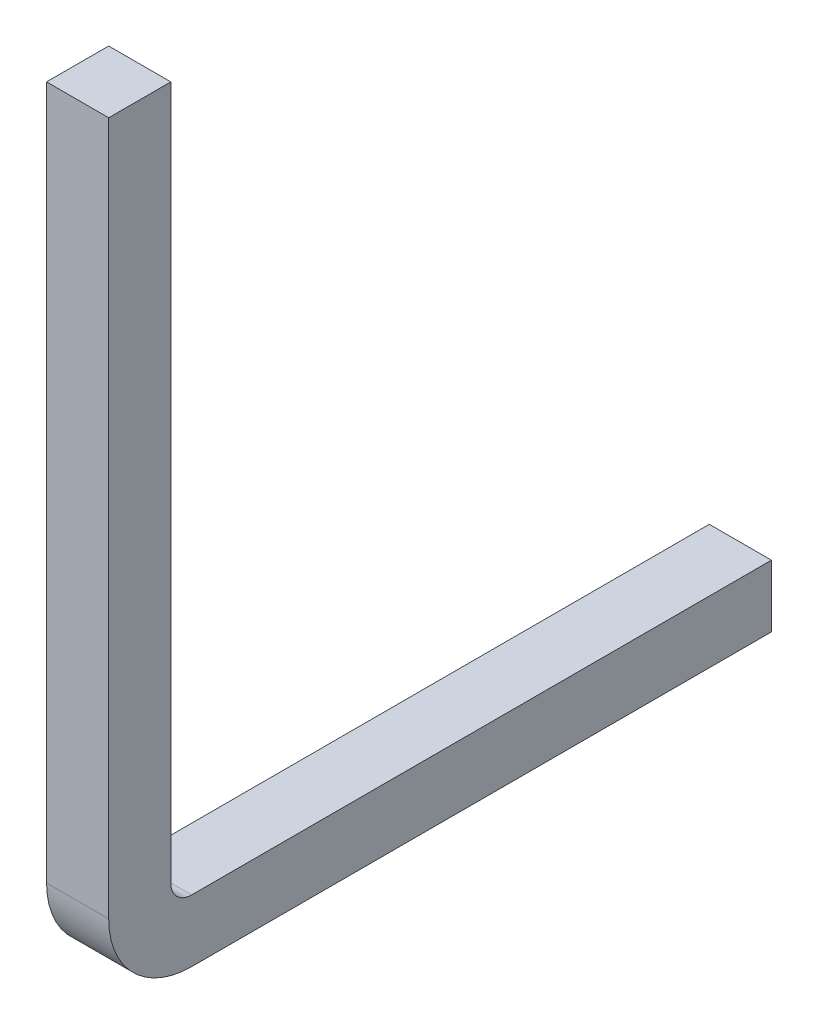
ISO-10303-21;
HEADER;
FILE_DESCRIPTION(('STEP AP214'),'2;1');
FILE_NAME('part.step','',(''),(''),'','','');
FILE_SCHEMA(('AUTOMOTIVE_DESIGN { 1 0 10303 214 1 1 1 1 }'));
ENDSEC;
DATA;
#1=APPLICATION_CONTEXT('core data for automotive mechanical design processes');
#2=APPLICATION_PROTOCOL_DEFINITION('international standard','automotive_design',2000,#1);
#3=PRODUCT_CONTEXT('',#1,'mechanical');
#4=PRODUCT('Part','Part','',(#3));
#5=PRODUCT_RELATED_PRODUCT_CATEGORY('part','',(#4));
#6=PRODUCT_DEFINITION_FORMATION('','',#4);
#7=PRODUCT_DEFINITION_CONTEXT('part definition',#1,'design');
#8=PRODUCT_DEFINITION('design','',#6,#7);
#9=PRODUCT_DEFINITION_SHAPE('','',#8);
#10=(LENGTH_UNIT() NAMED_UNIT(*) SI_UNIT(.MILLI.,.METRE.));
#11=(NAMED_UNIT(*) PLANE_ANGLE_UNIT() SI_UNIT($,.RADIAN.));
#12=(NAMED_UNIT(*) SI_UNIT($,.STERADIAN.) SOLID_ANGLE_UNIT());
#13=UNCERTAINTY_MEASURE_WITH_UNIT(LENGTH_MEASURE(1.E-05),#10,'distance_accuracy_value','');
#14=(GEOMETRIC_REPRESENTATION_CONTEXT(3) GLOBAL_UNCERTAINTY_ASSIGNED_CONTEXT((#13)) GLOBAL_UNIT_ASSIGNED_CONTEXT((#10,
#11,#12)) REPRESENTATION_CONTEXT('',''));
#15=CARTESIAN_POINT('',(0.,0.,0.));
#16=DIRECTION('',(0.,0.,1.));
#17=DIRECTION('',(1.,0.,0.));
#18=AXIS2_PLACEMENT_3D('',#15,#16,#17);
#19=CARTESIAN_POINT('',(0.,0.5,3.6));
#20=DIRECTION('',(1.,0.,0.));
#21=DIRECTION('',(0.,0.,1.));
#22=AXIS2_PLACEMENT_3D('',#19,#20,#21);
#23=CYLINDRICAL_SURFACE('',#22,0.2);
#24=CARTESIAN_POINT('',(0.3,0.5,3.6));
#25=DIRECTION('',(1.,0.,0.));
#26=DIRECTION('',(0.,0.,1.));
#27=AXIS2_PLACEMENT_3D('',#24,#25,#26);
#28=CIRCLE('',#27,0.2);
#29=CARTESIAN_POINT('',(0.3,0.5,3.8));
#30=VERTEX_POINT('',#29);
#31=CARTESIAN_POINT('',(0.3,0.3,3.6));
#32=VERTEX_POINT('',#31);
#33=EDGE_CURVE('E110',#30,#32,#28,.T.);
#34=ORIENTED_EDGE('',*,*,#33,.T.);
#35=DIRECTION('',(1.,0.,0.));
#36=VECTOR('',#35,1.);
#37=CARTESIAN_POINT('',(-0.3,0.3,3.6));
#38=LINE('',#37,#36);
#39=CARTESIAN_POINT('',(-0.3,0.3,3.6));
#40=VERTEX_POINT('',#39);
#41=EDGE_CURVE('E11',#40,#32,#38,.T.);
#42=ORIENTED_EDGE('',*,*,#41,.F.);
#43=CARTESIAN_POINT('',(-0.3,0.5,3.6));
#44=DIRECTION('',(1.,0.,0.));
#45=DIRECTION('',(0.,0.,1.));
#46=AXIS2_PLACEMENT_3D('',#43,#44,#45);
#47=CIRCLE('',#46,0.2);
#48=CARTESIAN_POINT('',(-0.3,0.5,3.8));
#49=VERTEX_POINT('',#48);
#50=EDGE_CURVE('E113',#49,#40,#47,.T.);
#51=ORIENTED_EDGE('',*,*,#50,.F.);
#52=DIRECTION('',(1.,0.,0.));
#53=VECTOR('',#52,1.);
#54=CARTESIAN_POINT('',(-0.3,0.5,3.8));
#55=LINE('',#54,#53);
#56=EDGE_CURVE('E106',#49,#30,#55,.T.);
#57=ORIENTED_EDGE('',*,*,#56,.T.);
#58=EDGE_LOOP('',(#34,#42,#51,#57));
#59=FACE_BOUND('',#58,.T.);
#60=ADVANCED_FACE('F16',(#59),#23,.F.);
#61=CARTESIAN_POINT('',(0.,0.3,0.8));
#62=DIRECTION('',(0.,1.,0.));
#63=DIRECTION('',(1.,0.,0.));
#64=AXIS2_PLACEMENT_3D('',#61,#62,#63);
#65=PLANE('',#64);
#66=DIRECTION('',(0.,0.,-1.));
#67=VECTOR('',#66,1.);
#68=CARTESIAN_POINT('',(0.3,0.3,3.6));
#69=LINE('',#68,#67);
#70=CARTESIAN_POINT('',(0.3,0.3,-2.));
#71=VERTEX_POINT('',#70);
#72=EDGE_CURVE('E133',#32,#71,#69,.T.);
#73=ORIENTED_EDGE('',*,*,#72,.T.);
#74=DIRECTION('',(1.,0.,0.));
#75=VECTOR('',#74,1.);
#76=CARTESIAN_POINT('',(-0.3,0.3,-2.));
#77=LINE('',#76,#75);
#78=CARTESIAN_POINT('',(-0.3,0.3,-2.));
#79=VERTEX_POINT('',#78);
#80=EDGE_CURVE('E27',#79,#71,#77,.T.);
#81=ORIENTED_EDGE('',*,*,#80,.F.);
#82=DIRECTION('',(0.,0.,-1.));
#83=VECTOR('',#82,1.);
#84=CARTESIAN_POINT('',(-0.3,0.3,3.6));
#85=LINE('',#84,#83);
#86=EDGE_CURVE('E170',#40,#79,#85,.T.);
#87=ORIENTED_EDGE('',*,*,#86,.F.);
#88=ORIENTED_EDGE('',*,*,#41,.T.);
#89=EDGE_LOOP('',(#73,#81,#87,#88));
#90=FACE_BOUND('',#89,.T.);
#91=ADVANCED_FACE('F339',(#90),#65,.T.);
#92=CARTESIAN_POINT('',(0.,0.,-2.));
#93=DIRECTION('',(0.,0.,-1.));
#94=DIRECTION('',(0.,-1.,0.));
#95=AXIS2_PLACEMENT_3D('',#92,#93,#94);
#96=PLANE('',#95);
#97=DIRECTION('',(0.,1.,0.));
#98=VECTOR('',#97,1.);
#99=CARTESIAN_POINT('',(-0.3,-0.3,-2.));
#100=LINE('',#99,#98);
#101=CARTESIAN_POINT('',(-0.3,-0.3,-2.));
#102=VERTEX_POINT('',#101);
#103=EDGE_CURVE('E166',#102,#79,#100,.T.);
#104=ORIENTED_EDGE('',*,*,#103,.T.);
#105=ORIENTED_EDGE('',*,*,#80,.T.);
#106=DIRECTION('',(0.,-1.,0.));
#107=VECTOR('',#106,1.);
#108=CARTESIAN_POINT('',(0.3,0.3,-2.));
#109=LINE('',#108,#107);
#110=CARTESIAN_POINT('',(0.3,-0.3,-2.));
#111=VERTEX_POINT('',#110);
#112=EDGE_CURVE('E20',#71,#111,#109,.T.);
#113=ORIENTED_EDGE('',*,*,#112,.T.);
#114=DIRECTION('',(-1.,0.,0.));
#115=VECTOR('',#114,1.);
#116=CARTESIAN_POINT('',(0.3,-0.3,-2.));
#117=LINE('',#116,#115);
#118=EDGE_CURVE('E145',#111,#102,#117,.T.);
#119=ORIENTED_EDGE('',*,*,#118,.T.);
#120=EDGE_LOOP('',(#104,#105,#113,#119));
#121=FACE_BOUND('',#120,.T.);
#122=ADVANCED_FACE('F180',(#121),#96,.T.);
#123=CARTESIAN_POINT('',(0.,-0.3,0.8));
#124=DIRECTION('',(0.,1.,0.));
#125=DIRECTION('',(1.,0.,0.));
#126=AXIS2_PLACEMENT_3D('',#123,#124,#125);
#127=PLANE('',#126);
#128=DIRECTION('',(0.,0.,-1.));
#129=VECTOR('',#128,1.);
#130=CARTESIAN_POINT('',(-0.3,-0.3,3.6));
#131=LINE('',#130,#129);
#132=CARTESIAN_POINT('',(-0.3,-0.3,3.6));
#133=VERTEX_POINT('',#132);
#134=EDGE_CURVE('E169',#133,#102,#131,.T.);
#135=ORIENTED_EDGE('',*,*,#134,.T.);
#136=ORIENTED_EDGE('',*,*,#118,.F.);
#137=DIRECTION('',(0.,0.,-1.));
#138=VECTOR('',#137,1.);
#139=CARTESIAN_POINT('',(0.3,-0.3,3.6));
#140=LINE('',#139,#138);
#141=CARTESIAN_POINT('',(0.3,-0.3,3.6));
#142=VERTEX_POINT('',#141);
#143=EDGE_CURVE('E155',#142,#111,#140,.T.);
#144=ORIENTED_EDGE('',*,*,#143,.F.);
#145=DIRECTION('',(-1.,0.,0.));
#146=VECTOR('',#145,1.);
#147=CARTESIAN_POINT('',(0.3,-0.3,3.6));
#148=LINE('',#147,#146);
#149=EDGE_CURVE('E41',#142,#133,#148,.T.);
#150=ORIENTED_EDGE('',*,*,#149,.T.);
#151=EDGE_LOOP('',(#135,#136,#144,#150));
#152=FACE_BOUND('',#151,.T.);
#153=ADVANCED_FACE('F184',(#152),#127,.F.);
#154=CARTESIAN_POINT('',(0.,0.5,3.6));
#155=DIRECTION('',(1.,0.,0.));
#156=DIRECTION('',(0.,0.,1.));
#157=AXIS2_PLACEMENT_3D('',#154,#155,#156);
#158=CYLINDRICAL_SURFACE('',#157,0.8);
#159=CARTESIAN_POINT('',(-0.3,0.5,3.6));
#160=DIRECTION('',(1.,0.,0.));
#161=DIRECTION('',(0.,0.,1.));
#162=AXIS2_PLACEMENT_3D('',#159,#160,#161);
#163=CIRCLE('',#162,0.8);
#164=CARTESIAN_POINT('',(-0.3,0.5,4.4));
#165=VERTEX_POINT('',#164);
#166=EDGE_CURVE('E80',#165,#133,#163,.T.);
#167=ORIENTED_EDGE('',*,*,#166,.T.);
#168=ORIENTED_EDGE('',*,*,#149,.F.);
#169=CARTESIAN_POINT('',(0.3,0.5,3.6));
#170=DIRECTION('',(1.,0.,0.));
#171=DIRECTION('',(0.,0.,1.));
#172=AXIS2_PLACEMENT_3D('',#169,#170,#171);
#173=CIRCLE('',#172,0.8);
#174=CARTESIAN_POINT('',(0.3,0.5,4.4));
#175=VERTEX_POINT('',#174);
#176=EDGE_CURVE('E67',#175,#142,#173,.T.);
#177=ORIENTED_EDGE('',*,*,#176,.F.);
#178=DIRECTION('',(-1.,0.,0.));
#179=VECTOR('',#178,1.);
#180=CARTESIAN_POINT('',(0.3,0.5,4.4));
#181=LINE('',#180,#179);
#182=EDGE_CURVE('E162',#175,#165,#181,.T.);
#183=ORIENTED_EDGE('',*,*,#182,.T.);
#184=EDGE_LOOP('',(#167,#168,#177,#183));
#185=FACE_BOUND('',#184,.T.);
#186=ADVANCED_FACE('F344',(#185),#158,.T.);
#187=CARTESIAN_POINT('',(-0.3,3.85,4.1));
#188=DIRECTION('',(1.,0.,0.));
#189=DIRECTION('',(0.,1.,0.));
#190=AXIS2_PLACEMENT_3D('',#187,#188,#189);
#191=PLANE('',#190);
#192=DIRECTION('',(0.,-1.,0.));
#193=VECTOR('',#192,1.);
#194=CARTESIAN_POINT('',(-0.3,7.2,3.8));
#195=LINE('',#194,#193);
#196=CARTESIAN_POINT('',(-0.3,7.2,3.8));
#197=VERTEX_POINT('',#196);
#198=EDGE_CURVE('E117',#197,#49,#195,.T.);
#199=ORIENTED_EDGE('',*,*,#198,.T.);
#200=ORIENTED_EDGE('',*,*,#50,.T.);
#201=ORIENTED_EDGE('',*,*,#86,.T.);
#202=ORIENTED_EDGE('',*,*,#103,.F.);
#203=ORIENTED_EDGE('',*,*,#134,.F.);
#204=ORIENTED_EDGE('',*,*,#166,.F.);
#205=DIRECTION('',(0.,-1.,0.));
#206=VECTOR('',#205,1.);
#207=CARTESIAN_POINT('',(-0.3,7.2,4.4));
#208=LINE('',#207,#206);
#209=CARTESIAN_POINT('',(-0.3,7.2,4.4));
#210=VERTEX_POINT('',#209);
#211=EDGE_CURVE('E158',#210,#165,#208,.T.);
#212=ORIENTED_EDGE('',*,*,#211,.F.);
#213=DIRECTION('',(0.,0.,-1.));
#214=VECTOR('',#213,1.);
#215=CARTESIAN_POINT('',(-0.3,7.2,4.4));
#216=LINE('',#215,#214);
#217=EDGE_CURVE('E151',#210,#197,#216,.T.);
#218=ORIENTED_EDGE('',*,*,#217,.T.);
#219=EDGE_LOOP('',(#199,#200,#201,#202,#203,#204,#212,#218));
#220=FACE_BOUND('',#219,.T.);
#221=ADVANCED_FACE('F204',(#220),#191,.F.);
#222=CARTESIAN_POINT('',(0.,3.85,3.8));
#223=DIRECTION('',(0.,0.,-1.));
#224=DIRECTION('',(0.,-1.,0.));
#225=AXIS2_PLACEMENT_3D('',#222,#223,#224);
#226=PLANE('',#225);
#227=DIRECTION('',(0.,-1.,0.));
#228=VECTOR('',#227,1.);
#229=CARTESIAN_POINT('',(0.3,7.2,3.8));
#230=LINE('',#229,#228);
#231=CARTESIAN_POINT('',(0.3,7.2,3.8));
#232=VERTEX_POINT('',#231);
#233=EDGE_CURVE('E118',#232,#30,#230,.T.);
#234=ORIENTED_EDGE('',*,*,#233,.T.);
#235=ORIENTED_EDGE('',*,*,#56,.F.);
#236=ORIENTED_EDGE('',*,*,#198,.F.);
#237=DIRECTION('',(1.,0.,0.));
#238=VECTOR('',#237,1.);
#239=CARTESIAN_POINT('',(-0.3,7.2,3.8));
#240=LINE('',#239,#238);
#241=EDGE_CURVE('E124',#197,#232,#240,.T.);
#242=ORIENTED_EDGE('',*,*,#241,.T.);
#243=EDGE_LOOP('',(#234,#235,#236,#242));
#244=FACE_BOUND('',#243,.T.);
#245=ADVANCED_FACE('F122',(#244),#226,.T.);
#246=CARTESIAN_POINT('',(0.3,3.85,4.1));
#247=DIRECTION('',(1.,0.,0.));
#248=DIRECTION('',(0.,1.,0.));
#249=AXIS2_PLACEMENT_3D('',#246,#247,#248);
#250=PLANE('',#249);
#251=DIRECTION('',(0.,-1.,0.));
#252=VECTOR('',#251,1.);
#253=CARTESIAN_POINT('',(0.3,7.2,4.4));
#254=LINE('',#253,#252);
#255=CARTESIAN_POINT('',(0.3,7.2,4.4));
#256=VERTEX_POINT('',#255);
#257=EDGE_CURVE('E156',#256,#175,#254,.T.);
#258=ORIENTED_EDGE('',*,*,#257,.T.);
#259=ORIENTED_EDGE('',*,*,#176,.T.);
#260=ORIENTED_EDGE('',*,*,#143,.T.);
#261=ORIENTED_EDGE('',*,*,#112,.F.);
#262=ORIENTED_EDGE('',*,*,#72,.F.);
#263=ORIENTED_EDGE('',*,*,#33,.F.);
#264=ORIENTED_EDGE('',*,*,#233,.F.);
#265=DIRECTION('',(0.,0.,1.));
#266=VECTOR('',#265,1.);
#267=CARTESIAN_POINT('',(0.3,7.2,3.8));
#268=LINE('',#267,#266);
#269=EDGE_CURVE('E147',#232,#256,#268,.T.);
#270=ORIENTED_EDGE('',*,*,#269,.T.);
#271=EDGE_LOOP('',(#258,#259,#260,#261,#262,#263,#264,#270));
#272=FACE_BOUND('',#271,.T.);
#273=ADVANCED_FACE('F130',(#272),#250,.T.);
#274=CARTESIAN_POINT('',(0.,3.85,4.4));
#275=DIRECTION('',(0.,0.,-1.));
#276=DIRECTION('',(0.,-1.,0.));
#277=AXIS2_PLACEMENT_3D('',#274,#275,#276);
#278=PLANE('',#277);
#279=ORIENTED_EDGE('',*,*,#211,.T.);
#280=ORIENTED_EDGE('',*,*,#182,.F.);
#281=ORIENTED_EDGE('',*,*,#257,.F.);
#282=DIRECTION('',(-1.,0.,0.));
#283=VECTOR('',#282,1.);
#284=CARTESIAN_POINT('',(0.3,7.2,4.4));
#285=LINE('',#284,#283);
#286=EDGE_CURVE('E163',#256,#210,#285,.T.);
#287=ORIENTED_EDGE('',*,*,#286,.T.);
#288=EDGE_LOOP('',(#279,#280,#281,#287));
#289=FACE_BOUND('',#288,.T.);
#290=ADVANCED_FACE('F18',(#289),#278,.F.);
#291=CARTESIAN_POINT('',(0.,7.2,4.1));
#292=DIRECTION('',(0.,-1.,0.));
#293=DIRECTION('',(0.,0.,-1.));
#294=AXIS2_PLACEMENT_3D('',#291,#292,#293);
#295=PLANE('',#294);
#296=ORIENTED_EDGE('',*,*,#269,.F.);
#297=ORIENTED_EDGE('',*,*,#241,.F.);
#298=ORIENTED_EDGE('',*,*,#217,.F.);
#299=ORIENTED_EDGE('',*,*,#286,.F.);
#300=EDGE_LOOP('',(#296,#297,#298,#299));
#301=FACE_BOUND('',#300,.T.);
#302=ADVANCED_FACE('F211',(#301),#295,.F.);
#303=CLOSED_SHELL('',(#60,#91,#122,#153,#186,#221,#245,#273,#290,#302));
#304=MANIFOLD_SOLID_BREP('B1',#303);
#305=ADVANCED_BREP_SHAPE_REPRESENTATION('',(#18,#304),#14);
#306=SHAPE_DEFINITION_REPRESENTATION(#9,#305);
ENDSEC;
END-ISO-10303-21;
